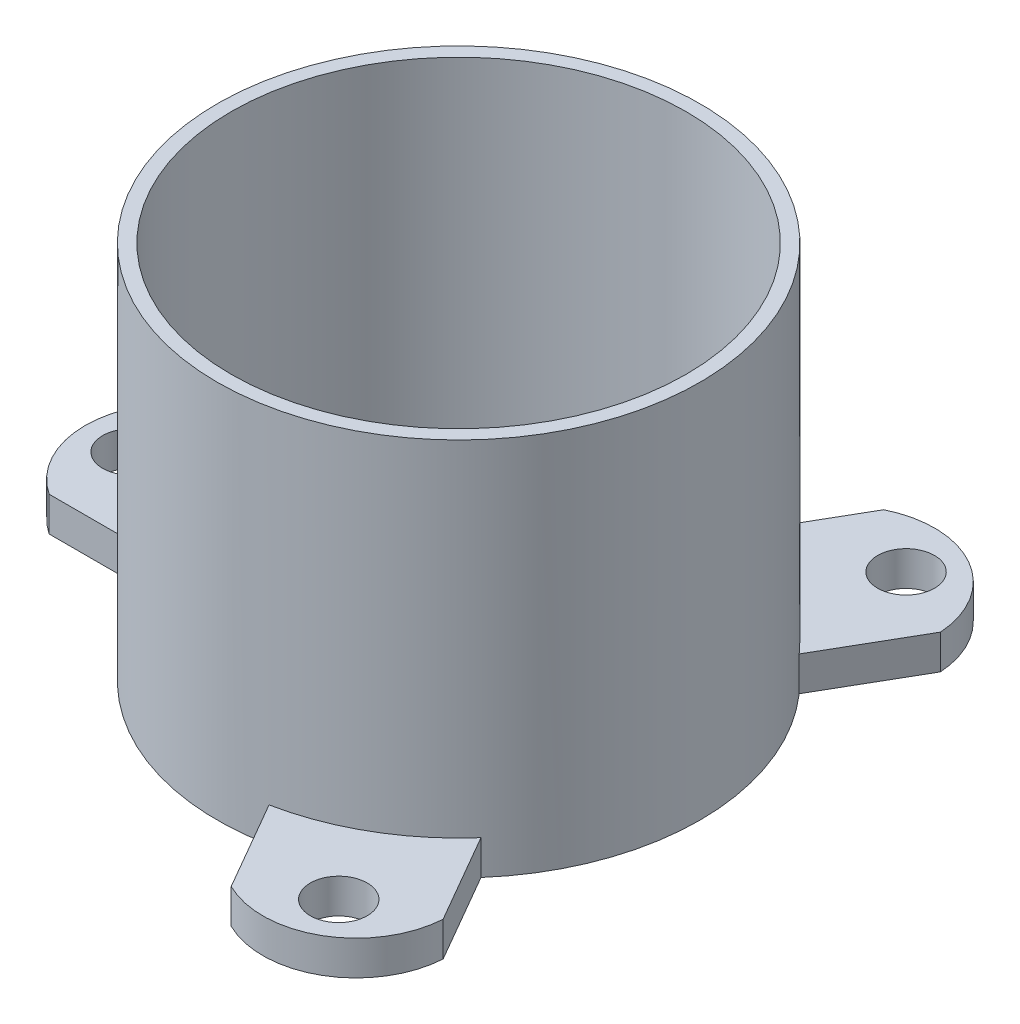
ISO-10303-21;
HEADER;
FILE_DESCRIPTION(('STEP AP214'),'2;1');
FILE_NAME('part.step','',(''),(''),'','','');
FILE_SCHEMA(('AUTOMOTIVE_DESIGN { 1 0 10303 214 1 1 1 1 }'));
ENDSEC;
DATA;
#1=APPLICATION_CONTEXT('core data for automotive mechanical design processes');
#2=APPLICATION_PROTOCOL_DEFINITION('international standard','automotive_design',2000,#1);
#3=PRODUCT_CONTEXT('',#1,'mechanical');
#4=PRODUCT('Part','Part','',(#3));
#5=PRODUCT_RELATED_PRODUCT_CATEGORY('part','',(#4));
#6=PRODUCT_DEFINITION_FORMATION('','',#4);
#7=PRODUCT_DEFINITION_CONTEXT('part definition',#1,'design');
#8=PRODUCT_DEFINITION('design','',#6,#7);
#9=PRODUCT_DEFINITION_SHAPE('','',#8);
#10=(LENGTH_UNIT() NAMED_UNIT(*) SI_UNIT(.MILLI.,.METRE.));
#11=(NAMED_UNIT(*) PLANE_ANGLE_UNIT() SI_UNIT($,.RADIAN.));
#12=(NAMED_UNIT(*) SI_UNIT($,.STERADIAN.) SOLID_ANGLE_UNIT());
#13=UNCERTAINTY_MEASURE_WITH_UNIT(LENGTH_MEASURE(1.E-05),#10,'distance_accuracy_value','');
#14=(GEOMETRIC_REPRESENTATION_CONTEXT(3) GLOBAL_UNCERTAINTY_ASSIGNED_CONTEXT((#13)) GLOBAL_UNIT_ASSIGNED_CONTEXT((#10,
#11,#12)) REPRESENTATION_CONTEXT('',''));
#15=CARTESIAN_POINT('',(0.,0.,0.));
#16=DIRECTION('',(0.,0.,1.));
#17=DIRECTION('',(1.,0.,0.));
#18=AXIS2_PLACEMENT_3D('',#15,#16,#17);
#19=CARTESIAN_POINT('',(0.,2.,0.));
#20=DIRECTION('',(0.,1.,0.));
#21=DIRECTION('',(0.,0.,1.));
#22=AXIS2_PLACEMENT_3D('',#19,#20,#21);
#23=PLANE('',#22);
#24=CARTESIAN_POINT('',(0.,2.,0.));
#25=DIRECTION('',(0.,1.,0.));
#26=DIRECTION('',(0.,0.,1.));
#27=AXIS2_PLACEMENT_3D('',#24,#25,#26);
#28=CIRCLE('',#27,14.);
#29=CARTESIAN_POINT('',(2.73142247475146,2.,13.730962503205));
#30=VERTEX_POINT('',#29);
#31=CARTESIAN_POINT('',(10.5256511088114,2.,9.23096250320503));
#32=VERTEX_POINT('',#31);
#33=EDGE_CURVE('E49',#30,#32,#28,.T.);
#34=ORIENTED_EDGE('',*,*,#33,.F.);
#35=DIRECTION('',(0.5,0.,0.866025403784439));
#36=VECTOR('',#35,1.);
#37=CARTESIAN_POINT('',(5.73142247475146,2.,18.9271149259117));
#38=LINE('',#37,#36);
#39=CARTESIAN_POINT('',(5.73142247475146,2.,18.9271149259117));
#40=VERTEX_POINT('',#39);
#41=EDGE_CURVE('E286',#30,#40,#38,.T.);
#42=ORIENTED_EDGE('',*,*,#41,.T.);
#43=CARTESIAN_POINT('',(8.12853679178143,2.,14.0790387145583));
#44=DIRECTION('',(0.,1.,0.));
#45=DIRECTION('',(0.,0.,1.));
#46=AXIS2_PLACEMENT_3D('',#43,#44,#45);
#47=CIRCLE('',#46,5.40832691319599);
#48=CARTESIAN_POINT('',(13.5256511088114,2.,14.4271149259117));
#49=VERTEX_POINT('',#48);
#50=EDGE_CURVE('E288',#40,#49,#47,.T.);
#51=ORIENTED_EDGE('',*,*,#50,.T.);
#52=DIRECTION('',(-0.5,0.,-0.866025403784438));
#53=VECTOR('',#52,1.);
#54=CARTESIAN_POINT('',(13.5256511088114,2.,14.4271149259117));
#55=LINE('',#54,#53);
#56=EDGE_CURVE('E144',#49,#32,#55,.T.);
#57=ORIENTED_EDGE('',*,*,#56,.T.);
#58=EDGE_LOOP('',(#34,#42,#51,#57));
#59=FACE_BOUND('',#58,.T.);
#60=CARTESIAN_POINT('',(9.50000000000001,2.,16.4544826719043));
#61=DIRECTION('',(0.,1.,0.));
#62=DIRECTION('',(0.,0.,1.));
#63=AXIS2_PLACEMENT_3D('',#60,#61,#62);
#64=CIRCLE('',#63,1.65000000000001);
#65=CARTESIAN_POINT('',(9.50000000000001,2.,18.1044826719043));
#66=VERTEX_POINT('',#65);
#67=EDGE_CURVE('E508',#66,#66,#64,.T.);
#68=ORIENTED_EDGE('',*,*,#67,.F.);
#69=EDGE_LOOP('',(#68));
#70=FACE_BOUND('',#69,.T.);
#71=ADVANCED_FACE('F37',(#59,#70),#23,.T.);
#72=CARTESIAN_POINT('',(10.5256511088114,2.,-9.23096250320504));
#73=VERTEX_POINT('',#72);
#74=CARTESIAN_POINT('',(2.73142247475145,2.,-13.730962503205));
#75=VERTEX_POINT('',#74);
#76=EDGE_CURVE('E11',#73,#75,#28,.T.);
#77=ORIENTED_EDGE('',*,*,#76,.F.);
#78=DIRECTION('',(0.5,0.,-0.866025403784439));
#79=VECTOR('',#78,1.);
#80=CARTESIAN_POINT('',(13.5256511088114,2.,-14.4271149259117));
#81=LINE('',#80,#79);
#82=CARTESIAN_POINT('',(13.5256511088114,2.,-14.4271149259117));
#83=VERTEX_POINT('',#82);
#84=EDGE_CURVE('E135',#73,#83,#81,.T.);
#85=ORIENTED_EDGE('',*,*,#84,.T.);
#86=CARTESIAN_POINT('',(8.12853679178142,2.,-14.0790387145584));
#87=DIRECTION('',(0.,1.,0.));
#88=DIRECTION('',(0.,0.,1.));
#89=AXIS2_PLACEMENT_3D('',#86,#87,#88);
#90=CIRCLE('',#89,5.40832691319598);
#91=CARTESIAN_POINT('',(5.73142247475145,2.,-18.9271149259117));
#92=VERTEX_POINT('',#91);
#93=EDGE_CURVE('E140',#83,#92,#90,.T.);
#94=ORIENTED_EDGE('',*,*,#93,.T.);
#95=DIRECTION('',(-0.5,0.,0.866025403784439));
#96=VECTOR('',#95,1.);
#97=CARTESIAN_POINT('',(5.73142247475145,2.,-18.9271149259117));
#98=LINE('',#97,#96);
#99=EDGE_CURVE('E57',#92,#75,#98,.T.);
#100=ORIENTED_EDGE('',*,*,#99,.T.);
#101=EDGE_LOOP('',(#77,#85,#94,#100));
#102=FACE_BOUND('',#101,.T.);
#103=CARTESIAN_POINT('',(9.5,2.,-16.4544826719043));
#104=DIRECTION('',(0.,1.,0.));
#105=DIRECTION('',(0.,0.,1.));
#106=AXIS2_PLACEMENT_3D('',#103,#104,#105);
#107=CIRCLE('',#106,1.65);
#108=CARTESIAN_POINT('',(9.5,2.,-14.8044826719043));
#109=VERTEX_POINT('',#108);
#110=EDGE_CURVE('E275',#109,#109,#107,.T.);
#111=ORIENTED_EDGE('',*,*,#110,.F.);
#112=EDGE_LOOP('',(#111));
#113=FACE_BOUND('',#112,.T.);
#114=ADVANCED_FACE('F137',(#102,#113),#23,.T.);
#115=CARTESIAN_POINT('',(-13.2570735835629,2.,-4.5));
#116=VERTEX_POINT('',#115);
#117=CARTESIAN_POINT('',(-13.2570735835629,2.,4.5));
#118=VERTEX_POINT('',#117);
#119=EDGE_CURVE('E47',#116,#118,#28,.T.);
#120=ORIENTED_EDGE('',*,*,#119,.F.);
#121=DIRECTION('',(-1.,0.,0.));
#122=VECTOR('',#121,1.);
#123=CARTESIAN_POINT('',(-19.2570735835629,2.,-4.5));
#124=LINE('',#123,#122);
#125=CARTESIAN_POINT('',(-19.2570735835629,2.,-4.5));
#126=VERTEX_POINT('',#125);
#127=EDGE_CURVE('E182',#116,#126,#124,.T.);
#128=ORIENTED_EDGE('',*,*,#127,.T.);
#129=CARTESIAN_POINT('',(-16.2570735835629,2.,0.));
#130=DIRECTION('',(0.,1.,0.));
#131=DIRECTION('',(0.,0.,1.));
#132=AXIS2_PLACEMENT_3D('',#129,#130,#131);
#133=CIRCLE('',#132,5.40832691319599);
#134=CARTESIAN_POINT('',(-19.2570735835629,2.,4.5));
#135=VERTEX_POINT('',#134);
#136=EDGE_CURVE('E282',#126,#135,#133,.T.);
#137=ORIENTED_EDGE('',*,*,#136,.T.);
#138=DIRECTION('',(1.,0.,0.));
#139=VECTOR('',#138,1.);
#140=CARTESIAN_POINT('',(-19.2570735835629,2.,4.5));
#141=LINE('',#140,#139);
#142=EDGE_CURVE('E284',#135,#118,#141,.T.);
#143=ORIENTED_EDGE('',*,*,#142,.T.);
#144=EDGE_LOOP('',(#120,#128,#137,#143));
#145=FACE_BOUND('',#144,.T.);
#146=CARTESIAN_POINT('',(-19.,2.,0.));
#147=DIRECTION('',(0.,1.,0.));
#148=DIRECTION('',(0.,0.,1.));
#149=AXIS2_PLACEMENT_3D('',#146,#147,#148);
#150=CIRCLE('',#149,1.65);
#151=CARTESIAN_POINT('',(-19.,2.,1.65));
#152=VERTEX_POINT('',#151);
#153=EDGE_CURVE('E163',#152,#152,#150,.T.);
#154=ORIENTED_EDGE('',*,*,#153,.F.);
#155=EDGE_LOOP('',(#154));
#156=FACE_BOUND('',#155,.T.);
#157=ADVANCED_FACE('F255',(#145,#156),#23,.T.);
#158=CARTESIAN_POINT('',(0.,0.,0.));
#159=DIRECTION('',(0.,1.,0.));
#160=DIRECTION('',(0.,0.,1.));
#161=AXIS2_PLACEMENT_3D('',#158,#159,#160);
#162=PLANE('',#161);
#163=CARTESIAN_POINT('',(0.,0.,0.));
#164=DIRECTION('',(0.,1.,0.));
#165=DIRECTION('',(0.,0.,1.));
#166=AXIS2_PLACEMENT_3D('',#163,#164,#165);
#167=CIRCLE('',#166,14.);
#168=CARTESIAN_POINT('',(2.73142247475145,0.,-13.730962503205));
#169=VERTEX_POINT('',#168);
#170=CARTESIAN_POINT('',(-13.2570735835629,0.,-4.5));
#171=VERTEX_POINT('',#170);
#172=EDGE_CURVE('E159',#169,#171,#167,.T.);
#173=ORIENTED_EDGE('',*,*,#172,.F.);
#174=DIRECTION('',(-0.5,0.,0.866025403784439));
#175=VECTOR('',#174,1.);
#176=CARTESIAN_POINT('',(5.73142247475145,0.,-18.9271149259117));
#177=LINE('',#176,#175);
#178=CARTESIAN_POINT('',(5.73142247475145,0.,-18.9271149259117));
#179=VERTEX_POINT('',#178);
#180=EDGE_CURVE('E105',#179,#169,#177,.T.);
#181=ORIENTED_EDGE('',*,*,#180,.F.);
#182=CARTESIAN_POINT('',(8.12853679178142,0.,-14.0790387145584));
#183=DIRECTION('',(0.,1.,0.));
#184=DIRECTION('',(0.,0.,1.));
#185=AXIS2_PLACEMENT_3D('',#182,#183,#184);
#186=CIRCLE('',#185,5.40832691319598);
#187=CARTESIAN_POINT('',(13.5256511088114,0.,-14.4271149259117));
#188=VERTEX_POINT('',#187);
#189=EDGE_CURVE('E99',#188,#179,#186,.T.);
#190=ORIENTED_EDGE('',*,*,#189,.F.);
#191=DIRECTION('',(0.5,0.,-0.866025403784439));
#192=VECTOR('',#191,1.);
#193=CARTESIAN_POINT('',(13.5256511088114,0.,-14.4271149259117));
#194=LINE('',#193,#192);
#195=CARTESIAN_POINT('',(10.5256511088114,0.,-9.23096250320504));
#196=VERTEX_POINT('',#195);
#197=EDGE_CURVE('E149',#196,#188,#194,.T.);
#198=ORIENTED_EDGE('',*,*,#197,.F.);
#199=CARTESIAN_POINT('',(0.,0.,0.));
#200=DIRECTION('',(0.,1.,0.));
#201=DIRECTION('',(0.,0.,1.));
#202=AXIS2_PLACEMENT_3D('',#199,#200,#201);
#203=CIRCLE('',#202,14.);
#204=CARTESIAN_POINT('',(10.5256511088114,0.,9.23096250320503));
#205=VERTEX_POINT('',#204);
#206=EDGE_CURVE('E177',#205,#196,#203,.T.);
#207=ORIENTED_EDGE('',*,*,#206,.F.);
#208=DIRECTION('',(-0.5,0.,-0.866025403784438));
#209=VECTOR('',#208,1.);
#210=CARTESIAN_POINT('',(13.5256511088114,0.,14.4271149259117));
#211=LINE('',#210,#209);
#212=CARTESIAN_POINT('',(13.5256511088114,0.,14.4271149259117));
#213=VERTEX_POINT('',#212);
#214=EDGE_CURVE('E175',#213,#205,#211,.T.);
#215=ORIENTED_EDGE('',*,*,#214,.F.);
#216=CARTESIAN_POINT('',(8.12853679178143,0.,14.0790387145583));
#217=DIRECTION('',(0.,1.,0.));
#218=DIRECTION('',(0.,0.,1.));
#219=AXIS2_PLACEMENT_3D('',#216,#217,#218);
#220=CIRCLE('',#219,5.40832691319599);
#221=CARTESIAN_POINT('',(5.73142247475146,0.,18.9271149259117));
#222=VERTEX_POINT('',#221);
#223=EDGE_CURVE('E173',#222,#213,#220,.T.);
#224=ORIENTED_EDGE('',*,*,#223,.F.);
#225=DIRECTION('',(0.5,0.,0.866025403784439));
#226=VECTOR('',#225,1.);
#227=CARTESIAN_POINT('',(5.73142247475146,0.,18.9271149259117));
#228=LINE('',#227,#226);
#229=CARTESIAN_POINT('',(2.73142247475147,0.,13.730962503205));
#230=VERTEX_POINT('',#229);
#231=EDGE_CURVE('E171',#230,#222,#228,.T.);
#232=ORIENTED_EDGE('',*,*,#231,.F.);
#233=CARTESIAN_POINT('',(0.,0.,0.));
#234=DIRECTION('',(0.,1.,0.));
#235=DIRECTION('',(0.,0.,1.));
#236=AXIS2_PLACEMENT_3D('',#233,#234,#235);
#237=CIRCLE('',#236,14.);
#238=CARTESIAN_POINT('',(-13.2570735835629,0.,4.5));
#239=VERTEX_POINT('',#238);
#240=EDGE_CURVE('E169',#239,#230,#237,.T.);
#241=ORIENTED_EDGE('',*,*,#240,.F.);
#242=DIRECTION('',(1.,0.,0.));
#243=VECTOR('',#242,1.);
#244=CARTESIAN_POINT('',(-19.2570735835629,0.,4.5));
#245=LINE('',#244,#243);
#246=CARTESIAN_POINT('',(-19.2570735835629,0.,4.5));
#247=VERTEX_POINT('',#246);
#248=EDGE_CURVE('E167',#247,#239,#245,.T.);
#249=ORIENTED_EDGE('',*,*,#248,.F.);
#250=CARTESIAN_POINT('',(-16.2570735835629,0.,0.));
#251=DIRECTION('',(0.,1.,0.));
#252=DIRECTION('',(0.,0.,1.));
#253=AXIS2_PLACEMENT_3D('',#250,#251,#252);
#254=CIRCLE('',#253,5.40832691319599);
#255=CARTESIAN_POINT('',(-19.2570735835629,0.,-4.5));
#256=VERTEX_POINT('',#255);
#257=EDGE_CURVE('E165',#256,#247,#254,.T.);
#258=ORIENTED_EDGE('',*,*,#257,.F.);
#259=DIRECTION('',(-1.,0.,0.));
#260=VECTOR('',#259,1.);
#261=CARTESIAN_POINT('',(-19.2570735835629,0.,-4.5));
#262=LINE('',#261,#260);
#263=EDGE_CURVE('E162',#171,#256,#262,.T.);
#264=ORIENTED_EDGE('',*,*,#263,.F.);
#265=EDGE_LOOP('',(#173,#181,#190,#198,#207,#215,#224,#232,#241,#249,#258,#264));
#266=FACE_BOUND('',#265,.T.);
#267=CARTESIAN_POINT('',(-19.,0.,0.));
#268=DIRECTION('',(0.,1.,0.));
#269=DIRECTION('',(0.,0.,1.));
#270=AXIS2_PLACEMENT_3D('',#267,#268,#269);
#271=CIRCLE('',#270,1.65);
#272=CARTESIAN_POINT('',(-19.,0.,1.65));
#273=VERTEX_POINT('',#272);
#274=EDGE_CURVE('E272',#273,#273,#271,.T.);
#275=ORIENTED_EDGE('',*,*,#274,.T.);
#276=EDGE_LOOP('',(#275));
#277=FACE_BOUND('',#276,.T.);
#278=CARTESIAN_POINT('',(9.5,0.,-16.4544826719043));
#279=DIRECTION('',(0.,1.,0.));
#280=DIRECTION('',(0.,0.,1.));
#281=AXIS2_PLACEMENT_3D('',#278,#279,#280);
#282=CIRCLE('',#281,1.65);
#283=CARTESIAN_POINT('',(9.5,0.,-14.8044826719043));
#284=VERTEX_POINT('',#283);
#285=EDGE_CURVE('E278',#284,#284,#282,.T.);
#286=ORIENTED_EDGE('',*,*,#285,.T.);
#287=EDGE_LOOP('',(#286));
#288=FACE_BOUND('',#287,.T.);
#289=CARTESIAN_POINT('',(9.50000000000001,0.,16.4544826719043));
#290=DIRECTION('',(0.,1.,0.));
#291=DIRECTION('',(0.,0.,1.));
#292=AXIS2_PLACEMENT_3D('',#289,#290,#291);
#293=CIRCLE('',#292,1.65000000000001);
#294=CARTESIAN_POINT('',(9.50000000000001,0.,18.1044826719043));
#295=VERTEX_POINT('',#294);
#296=EDGE_CURVE('E221',#295,#295,#293,.T.);
#297=ORIENTED_EDGE('',*,*,#296,.T.);
#298=EDGE_LOOP('',(#297));
#299=FACE_BOUND('',#298,.T.);
#300=ADVANCED_FACE('F263',(#266,#277,#288,#299),#162,.F.);
#301=CARTESIAN_POINT('',(-19.2570735835629,2.,-4.5));
#302=DIRECTION('',(0.,0.,1.));
#303=DIRECTION('',(1.,0.,0.));
#304=AXIS2_PLACEMENT_3D('',#301,#302,#303);
#305=PLANE('',#304);
#306=ORIENTED_EDGE('',*,*,#263,.T.);
#307=DIRECTION('',(0.,-1.,0.));
#308=VECTOR('',#307,1.);
#309=CARTESIAN_POINT('',(-19.2570735835629,2.,-4.5));
#310=LINE('',#309,#308);
#311=EDGE_CURVE('E203',#126,#256,#310,.T.);
#312=ORIENTED_EDGE('',*,*,#311,.F.);
#313=ORIENTED_EDGE('',*,*,#127,.F.);
#314=DIRECTION('',(0.,-1.,0.));
#315=VECTOR('',#314,1.);
#316=CARTESIAN_POINT('',(-13.2570735835629,2.,-4.5));
#317=LINE('',#316,#315);
#318=EDGE_CURVE('E41',#116,#171,#317,.T.);
#319=ORIENTED_EDGE('',*,*,#318,.T.);
#320=EDGE_LOOP('',(#306,#312,#313,#319));
#321=FACE_BOUND('',#320,.T.);
#322=ADVANCED_FACE('F39',(#321),#305,.F.);
#323=CARTESIAN_POINT('',(-16.2570735835629,2.,0.));
#324=DIRECTION('',(0.,-1.,0.));
#325=DIRECTION('',(0.,0.,-1.));
#326=AXIS2_PLACEMENT_3D('',#323,#324,#325);
#327=CYLINDRICAL_SURFACE('',#326,5.40832691319599);
#328=ORIENTED_EDGE('',*,*,#257,.T.);
#329=DIRECTION('',(0.,-1.,0.));
#330=VECTOR('',#329,1.);
#331=CARTESIAN_POINT('',(-19.2570735835629,2.,4.5));
#332=LINE('',#331,#330);
#333=EDGE_CURVE('E201',#135,#247,#332,.T.);
#334=ORIENTED_EDGE('',*,*,#333,.F.);
#335=ORIENTED_EDGE('',*,*,#136,.F.);
#336=ORIENTED_EDGE('',*,*,#311,.T.);
#337=EDGE_LOOP('',(#328,#334,#335,#336));
#338=FACE_BOUND('',#337,.T.);
#339=ADVANCED_FACE('F435',(#338),#327,.T.);
#340=CARTESIAN_POINT('',(-19.2570735835629,2.,4.5));
#341=DIRECTION('',(0.,0.,-1.));
#342=DIRECTION('',(-1.,0.,0.));
#343=AXIS2_PLACEMENT_3D('',#340,#341,#342);
#344=PLANE('',#343);
#345=ORIENTED_EDGE('',*,*,#248,.T.);
#346=DIRECTION('',(0.,-1.,0.));
#347=VECTOR('',#346,1.);
#348=CARTESIAN_POINT('',(-13.2570735835629,2.,4.5));
#349=LINE('',#348,#347);
#350=EDGE_CURVE('E198',#118,#239,#349,.T.);
#351=ORIENTED_EDGE('',*,*,#350,.F.);
#352=ORIENTED_EDGE('',*,*,#142,.F.);
#353=ORIENTED_EDGE('',*,*,#333,.T.);
#354=EDGE_LOOP('',(#345,#351,#352,#353));
#355=FACE_BOUND('',#354,.T.);
#356=ADVANCED_FACE('F425',(#355),#344,.F.);
#357=CARTESIAN_POINT('',(5.73142247475146,2.,18.9271149259117));
#358=DIRECTION('',(0.866025403784439,0.,-0.5));
#359=DIRECTION('',(-0.5,0.,-0.866025403784439));
#360=AXIS2_PLACEMENT_3D('',#357,#358,#359);
#361=PLANE('',#360);
#362=ORIENTED_EDGE('',*,*,#231,.T.);
#363=DIRECTION('',(0.,-1.,0.));
#364=VECTOR('',#363,1.);
#365=CARTESIAN_POINT('',(5.73142247475146,2.,18.9271149259117));
#366=LINE('',#365,#364);
#367=EDGE_CURVE('E192',#40,#222,#366,.T.);
#368=ORIENTED_EDGE('',*,*,#367,.F.);
#369=ORIENTED_EDGE('',*,*,#41,.F.);
#370=DIRECTION('',(0.,-1.,0.));
#371=VECTOR('',#370,1.);
#372=CARTESIAN_POINT('',(2.73142247475147,2.,13.730962503205));
#373=LINE('',#372,#371);
#374=EDGE_CURVE('E195',#30,#230,#373,.T.);
#375=ORIENTED_EDGE('',*,*,#374,.T.);
#376=EDGE_LOOP('',(#362,#368,#369,#375));
#377=FACE_BOUND('',#376,.T.);
#378=ADVANCED_FACE('F416',(#377),#361,.F.);
#379=CARTESIAN_POINT('',(8.12853679178143,2.,14.0790387145583));
#380=DIRECTION('',(0.,-1.,0.));
#381=DIRECTION('',(0.,0.,-1.));
#382=AXIS2_PLACEMENT_3D('',#379,#380,#381);
#383=CYLINDRICAL_SURFACE('',#382,5.40832691319599);
#384=ORIENTED_EDGE('',*,*,#223,.T.);
#385=DIRECTION('',(0.,-1.,0.));
#386=VECTOR('',#385,1.);
#387=CARTESIAN_POINT('',(13.5256511088114,2.,14.4271149259117));
#388=LINE('',#387,#386);
#389=EDGE_CURVE('E189',#49,#213,#388,.T.);
#390=ORIENTED_EDGE('',*,*,#389,.F.);
#391=ORIENTED_EDGE('',*,*,#50,.F.);
#392=ORIENTED_EDGE('',*,*,#367,.T.);
#393=EDGE_LOOP('',(#384,#390,#391,#392));
#394=FACE_BOUND('',#393,.T.);
#395=ADVANCED_FACE('F249',(#394),#383,.T.);
#396=CARTESIAN_POINT('',(13.5256511088114,2.,14.4271149259117));
#397=DIRECTION('',(-0.866025403784438,0.,0.5));
#398=DIRECTION('',(0.5,0.,0.866025403784438));
#399=AXIS2_PLACEMENT_3D('',#396,#397,#398);
#400=PLANE('',#399);
#401=ORIENTED_EDGE('',*,*,#214,.T.);
#402=DIRECTION('',(0.,-1.,0.));
#403=VECTOR('',#402,1.);
#404=CARTESIAN_POINT('',(10.5256511088114,2.,9.23096250320503));
#405=LINE('',#404,#403);
#406=EDGE_CURVE('E186',#32,#205,#405,.T.);
#407=ORIENTED_EDGE('',*,*,#406,.F.);
#408=ORIENTED_EDGE('',*,*,#56,.F.);
#409=ORIENTED_EDGE('',*,*,#389,.T.);
#410=EDGE_LOOP('',(#401,#407,#408,#409));
#411=FACE_BOUND('',#410,.T.);
#412=ADVANCED_FACE('F242',(#411),#400,.F.);
#413=CARTESIAN_POINT('',(0.,2.,0.));
#414=DIRECTION('',(0.,-1.,0.));
#415=DIRECTION('',(0.,0.,-1.));
#416=AXIS2_PLACEMENT_3D('',#413,#414,#415);
#417=CYLINDRICAL_SURFACE('',#416,14.);
#418=ORIENTED_EDGE('',*,*,#206,.T.);
#419=DIRECTION('',(0.,-1.,0.));
#420=VECTOR('',#419,1.);
#421=CARTESIAN_POINT('',(10.5256511088114,2.,-9.23096250320504));
#422=LINE('',#421,#420);
#423=EDGE_CURVE('E150',#73,#196,#422,.T.);
#424=ORIENTED_EDGE('',*,*,#423,.F.);
#425=ORIENTED_EDGE('',*,*,#76,.T.);
#426=DIRECTION('',(0.,-1.,0.));
#427=VECTOR('',#426,1.);
#428=CARTESIAN_POINT('',(2.73142247475145,2.,-13.730962503205));
#429=LINE('',#428,#427);
#430=EDGE_CURVE('E155',#75,#169,#429,.T.);
#431=ORIENTED_EDGE('',*,*,#430,.T.);
#432=ORIENTED_EDGE('',*,*,#172,.T.);
#433=ORIENTED_EDGE('',*,*,#318,.F.);
#434=ORIENTED_EDGE('',*,*,#119,.T.);
#435=ORIENTED_EDGE('',*,*,#350,.T.);
#436=ORIENTED_EDGE('',*,*,#240,.T.);
#437=ORIENTED_EDGE('',*,*,#374,.F.);
#438=ORIENTED_EDGE('',*,*,#33,.T.);
#439=ORIENTED_EDGE('',*,*,#406,.T.);
#440=EDGE_LOOP('',(#418,#424,#425,#431,#432,#433,#434,#435,#436,#437,#438,#439));
#441=FACE_BOUND('',#440,.T.);
#442=CARTESIAN_POINT('',(0.,22.,0.));
#443=DIRECTION('',(0.,1.,0.));
#444=DIRECTION('',(0.,0.,1.));
#445=AXIS2_PLACEMENT_3D('',#442,#443,#444);
#446=CIRCLE('',#445,14.);
#447=CARTESIAN_POINT('',(0.,22.,14.));
#448=VERTEX_POINT('',#447);
#449=EDGE_CURVE('E216',#448,#448,#446,.T.);
#450=ORIENTED_EDGE('',*,*,#449,.F.);
#451=EDGE_LOOP('',(#450));
#452=FACE_BOUND('',#451,.T.);
#453=ADVANCED_FACE('F240',(#441,#452),#417,.T.);
#454=CARTESIAN_POINT('',(13.5256511088114,2.,-14.4271149259117));
#455=DIRECTION('',(-0.866025403784439,0.,-0.5));
#456=DIRECTION('',(-0.5,0.,0.866025403784439));
#457=AXIS2_PLACEMENT_3D('',#454,#455,#456);
#458=PLANE('',#457);
#459=ORIENTED_EDGE('',*,*,#197,.T.);
#460=DIRECTION('',(0.,-1.,0.));
#461=VECTOR('',#460,1.);
#462=CARTESIAN_POINT('',(13.5256511088114,2.,-14.4271149259117));
#463=LINE('',#462,#461);
#464=EDGE_CURVE('E146',#83,#188,#463,.T.);
#465=ORIENTED_EDGE('',*,*,#464,.F.);
#466=ORIENTED_EDGE('',*,*,#84,.F.);
#467=ORIENTED_EDGE('',*,*,#423,.T.);
#468=EDGE_LOOP('',(#459,#465,#466,#467));
#469=FACE_BOUND('',#468,.T.);
#470=ADVANCED_FACE('F147',(#469),#458,.F.);
#471=CARTESIAN_POINT('',(8.12853679178142,2.,-14.0790387145584));
#472=DIRECTION('',(0.,-1.,0.));
#473=DIRECTION('',(0.,0.,-1.));
#474=AXIS2_PLACEMENT_3D('',#471,#472,#473);
#475=CYLINDRICAL_SURFACE('',#474,5.40832691319598);
#476=ORIENTED_EDGE('',*,*,#189,.T.);
#477=DIRECTION('',(0.,-1.,0.));
#478=VECTOR('',#477,1.);
#479=CARTESIAN_POINT('',(5.73142247475145,2.,-18.9271149259117));
#480=LINE('',#479,#478);
#481=EDGE_CURVE('E151',#92,#179,#480,.T.);
#482=ORIENTED_EDGE('',*,*,#481,.F.);
#483=ORIENTED_EDGE('',*,*,#93,.F.);
#484=ORIENTED_EDGE('',*,*,#464,.T.);
#485=EDGE_LOOP('',(#476,#482,#483,#484));
#486=FACE_BOUND('',#485,.T.);
#487=ADVANCED_FACE('F153',(#486),#475,.T.);
#488=CARTESIAN_POINT('',(5.73142247475145,2.,-18.9271149259117));
#489=DIRECTION('',(0.866025403784439,0.,0.5));
#490=DIRECTION('',(0.5,0.,-0.866025403784439));
#491=AXIS2_PLACEMENT_3D('',#488,#489,#490);
#492=PLANE('',#491);
#493=ORIENTED_EDGE('',*,*,#180,.T.);
#494=ORIENTED_EDGE('',*,*,#430,.F.);
#495=ORIENTED_EDGE('',*,*,#99,.F.);
#496=ORIENTED_EDGE('',*,*,#481,.T.);
#497=EDGE_LOOP('',(#493,#494,#495,#496));
#498=FACE_BOUND('',#497,.T.);
#499=ADVANCED_FACE('F298',(#498),#492,.F.);
#500=CARTESIAN_POINT('',(-19.,2.,0.));
#501=DIRECTION('',(0.,-1.,0.));
#502=DIRECTION('',(0.,0.,-1.));
#503=AXIS2_PLACEMENT_3D('',#500,#501,#502);
#504=CYLINDRICAL_SURFACE('',#503,1.65);
#505=ORIENTED_EDGE('',*,*,#153,.T.);
#506=EDGE_LOOP('',(#505));
#507=FACE_BOUND('',#506,.T.);
#508=ORIENTED_EDGE('',*,*,#274,.F.);
#509=EDGE_LOOP('',(#508));
#510=FACE_BOUND('',#509,.T.);
#511=ADVANCED_FACE('F300',(#507,#510),#504,.F.);
#512=CARTESIAN_POINT('',(9.5,2.,-16.4544826719043));
#513=DIRECTION('',(0.,-1.,0.));
#514=DIRECTION('',(0.,0.,-1.));
#515=AXIS2_PLACEMENT_3D('',#512,#513,#514);
#516=CYLINDRICAL_SURFACE('',#515,1.65);
#517=ORIENTED_EDGE('',*,*,#110,.T.);
#518=EDGE_LOOP('',(#517));
#519=FACE_BOUND('',#518,.T.);
#520=ORIENTED_EDGE('',*,*,#285,.F.);
#521=EDGE_LOOP('',(#520));
#522=FACE_BOUND('',#521,.T.);
#523=ADVANCED_FACE('F306',(#519,#522),#516,.F.);
#524=CARTESIAN_POINT('',(9.50000000000001,2.,16.4544826719043));
#525=DIRECTION('',(0.,-1.,0.));
#526=DIRECTION('',(0.,0.,-1.));
#527=AXIS2_PLACEMENT_3D('',#524,#525,#526);
#528=CYLINDRICAL_SURFACE('',#527,1.65000000000001);
#529=ORIENTED_EDGE('',*,*,#67,.T.);
#530=EDGE_LOOP('',(#529));
#531=FACE_BOUND('',#530,.T.);
#532=ORIENTED_EDGE('',*,*,#296,.F.);
#533=EDGE_LOOP('',(#532));
#534=FACE_BOUND('',#533,.T.);
#535=ADVANCED_FACE('F236',(#531,#534),#528,.F.);
#536=CARTESIAN_POINT('',(0.,22.,0.));
#537=DIRECTION('',(0.,1.,0.));
#538=DIRECTION('',(0.,0.,1.));
#539=AXIS2_PLACEMENT_3D('',#536,#537,#538);
#540=PLANE('',#539);
#541=CARTESIAN_POINT('',(0.,22.,0.));
#542=DIRECTION('',(0.,1.,0.));
#543=DIRECTION('',(0.,0.,1.));
#544=AXIS2_PLACEMENT_3D('',#541,#542,#543);
#545=CIRCLE('',#544,13.2);
#546=CARTESIAN_POINT('',(0.,22.,13.2));
#547=VERTEX_POINT('',#546);
#548=EDGE_CURVE('E223',#547,#547,#545,.T.);
#549=ORIENTED_EDGE('',*,*,#548,.F.);
#550=EDGE_LOOP('',(#549));
#551=FACE_BOUND('',#550,.T.);
#552=ORIENTED_EDGE('',*,*,#449,.T.);
#553=EDGE_LOOP('',(#552));
#554=FACE_BOUND('',#553,.T.);
#555=ADVANCED_FACE('F233',(#551,#554),#540,.T.);
#556=CARTESIAN_POINT('',(0.,2.,0.));
#557=DIRECTION('',(0.,1.,0.));
#558=DIRECTION('',(0.,0.,1.));
#559=AXIS2_PLACEMENT_3D('',#556,#557,#558);
#560=CYLINDRICAL_SURFACE('',#559,13.2);
#561=CARTESIAN_POINT('',(0.,2.,0.));
#562=DIRECTION('',(0.,1.,0.));
#563=DIRECTION('',(0.,0.,1.));
#564=AXIS2_PLACEMENT_3D('',#561,#562,#563);
#565=CIRCLE('',#564,13.2);
#566=CARTESIAN_POINT('',(0.,2.,13.2));
#567=VERTEX_POINT('',#566);
#568=EDGE_CURVE('E217',#567,#567,#565,.T.);
#569=ORIENTED_EDGE('',*,*,#568,.F.);
#570=EDGE_LOOP('',(#569));
#571=FACE_BOUND('',#570,.T.);
#572=ORIENTED_EDGE('',*,*,#548,.T.);
#573=EDGE_LOOP('',(#572));
#574=FACE_BOUND('',#573,.T.);
#575=ADVANCED_FACE('F231',(#571,#574),#560,.F.);
#576=CARTESIAN_POINT('',(0.,2.,0.));
#577=DIRECTION('',(0.,1.,0.));
#578=DIRECTION('',(0.,0.,1.));
#579=AXIS2_PLACEMENT_3D('',#576,#577,#578);
#580=PLANE('',#579);
#581=ORIENTED_EDGE('',*,*,#568,.T.);
#582=EDGE_LOOP('',(#581));
#583=FACE_BOUND('',#582,.T.);
#584=ADVANCED_FACE('F344',(#583),#580,.T.);
#585=CLOSED_SHELL('',(#71,#114,#157,#300,#322,#339,#356,#378,#395,#412,#453,#470,#487,#499,#511,
#523,#535,#555,#575,#584));
#586=MANIFOLD_SOLID_BREP('B2',#585);
#587=ADVANCED_BREP_SHAPE_REPRESENTATION('',(#18,#586),#14);
#588=SHAPE_DEFINITION_REPRESENTATION(#9,#587);
ENDSEC;
END-ISO-10303-21;
